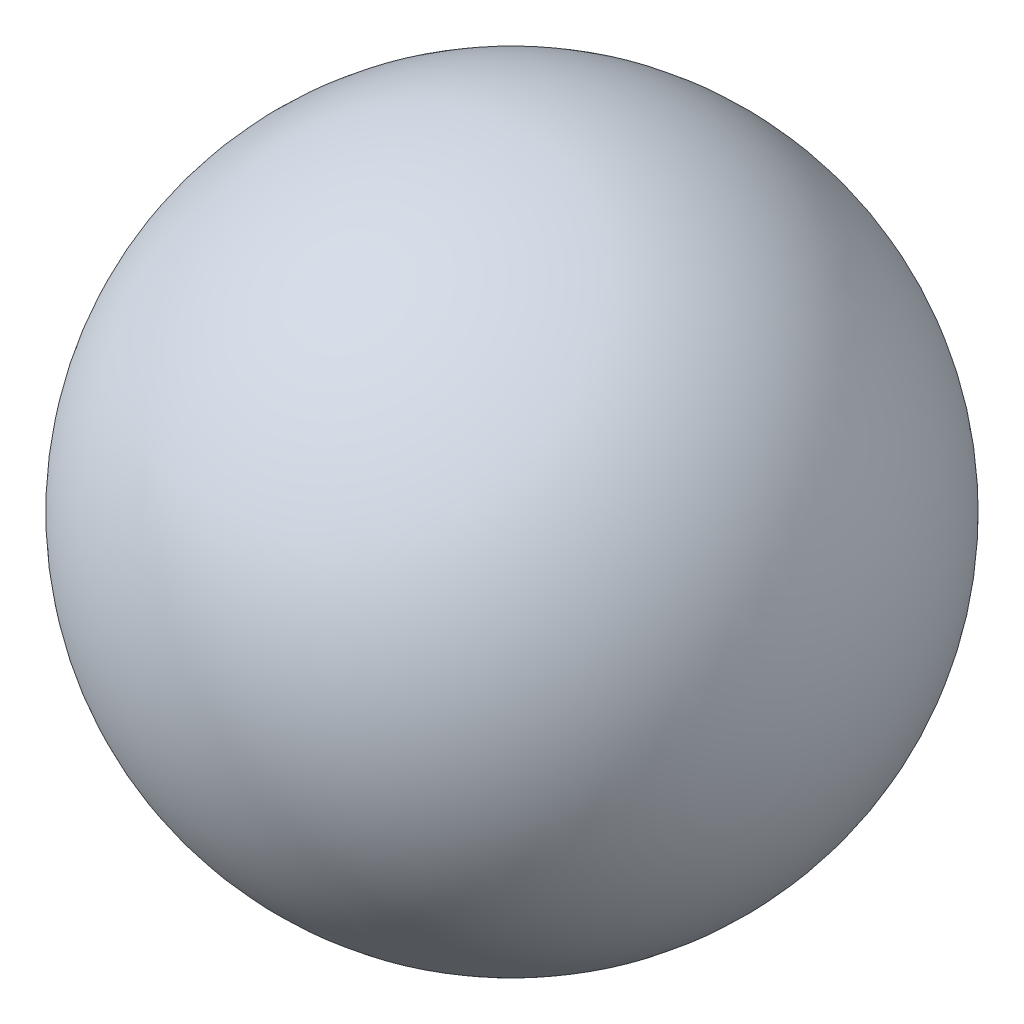
ISO-10303-21;
HEADER;
FILE_DESCRIPTION(('STEP AP214'),'2;1');
FILE_NAME('part.step','',(''),(''),'','','');
FILE_SCHEMA(('AUTOMOTIVE_DESIGN { 1 0 10303 214 1 1 1 1 }'));
ENDSEC;
DATA;
#1=APPLICATION_CONTEXT('core data for automotive mechanical design processes');
#2=APPLICATION_PROTOCOL_DEFINITION('international standard','automotive_design',2000,#1);
#3=PRODUCT_CONTEXT('',#1,'mechanical');
#4=PRODUCT('Part','Part','',(#3));
#5=PRODUCT_RELATED_PRODUCT_CATEGORY('part','',(#4));
#6=PRODUCT_DEFINITION_FORMATION('','',#4);
#7=PRODUCT_DEFINITION_CONTEXT('part definition',#1,'design');
#8=PRODUCT_DEFINITION('design','',#6,#7);
#9=PRODUCT_DEFINITION_SHAPE('','',#8);
#10=(LENGTH_UNIT() NAMED_UNIT(*) SI_UNIT(.MILLI.,.METRE.));
#11=(NAMED_UNIT(*) PLANE_ANGLE_UNIT() SI_UNIT($,.RADIAN.));
#12=(NAMED_UNIT(*) SI_UNIT($,.STERADIAN.) SOLID_ANGLE_UNIT());
#13=UNCERTAINTY_MEASURE_WITH_UNIT(LENGTH_MEASURE(1.E-05),#10,'distance_accuracy_value','');
#14=(GEOMETRIC_REPRESENTATION_CONTEXT(3) GLOBAL_UNCERTAINTY_ASSIGNED_CONTEXT((#13)) GLOBAL_UNIT_ASSIGNED_CONTEXT((#10,
#11,#12)) REPRESENTATION_CONTEXT('',''));
#15=CARTESIAN_POINT('',(0.,0.,0.));
#16=DIRECTION('',(0.,0.,1.));
#17=DIRECTION('',(1.,0.,0.));
#18=AXIS2_PLACEMENT_3D('',#15,#16,#17);
#19=CARTESIAN_POINT('',(-23.2492817948892,22.8441908713693,0.));
#20=DIRECTION('',(0.,-1.,0.));
#21=DIRECTION('',(-1.,0.,0.));
#22=AXIS2_PLACEMENT_3D('',#19,#20,#21);
#23=SPHERICAL_SURFACE('',#22,20.001);
#24=CARTESIAN_POINT('',(-23.2492817948892,2.84319087136929,0.));
#25=VERTEX_POINT('',#24);
#26=VERTEX_LOOP('',#25);
#27=FACE_BOUND('',#26,.T.);
#28=ADVANCED_FACE('F31',(#27),#23,.T.);
#29=CLOSED_SHELL('',(#28));
#30=CARTESIAN_POINT('',(-23.2492817948892,22.8441908713693,0.));
#31=DIRECTION('',(0.,-1.,0.));
#32=DIRECTION('',(-1.,0.,0.));
#33=AXIS2_PLACEMENT_3D('',#30,#31,#32);
#34=SPHERICAL_SURFACE('',#33,20.);
#35=CARTESIAN_POINT('',(-23.2492817948892,2.84419087136929,0.));
#36=VERTEX_POINT('',#35);
#37=VERTEX_LOOP('',#36);
#38=FACE_BOUND('',#37,.T.);
#39=ADVANCED_FACE('F43',(#38),#34,.F.);
#40=CLOSED_SHELL('',(#39));
#41=ORIENTED_CLOSED_SHELL('',*,#40,.T.);
#42=BREP_WITH_VOIDS('B2',#29,(#41));
#43=ADVANCED_BREP_SHAPE_REPRESENTATION('',(#18,#42),#14);
#44=SHAPE_DEFINITION_REPRESENTATION(#9,#43);
ENDSEC;
END-ISO-10303-21;
